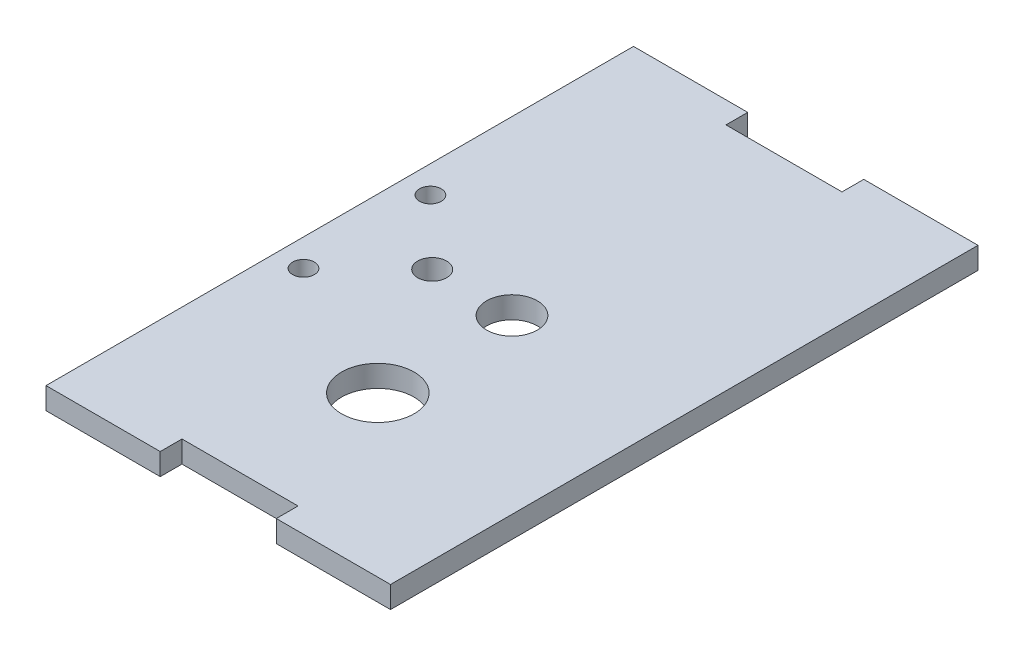
ISO-10303-21;
HEADER;
FILE_DESCRIPTION(('STEP AP214'),'2;1');
FILE_NAME('part.step','',(''),(''),'','','');
FILE_SCHEMA(('AUTOMOTIVE_DESIGN { 1 0 10303 214 1 1 1 1 }'));
ENDSEC;
DATA;
#1=APPLICATION_CONTEXT('core data for automotive mechanical design processes');
#2=APPLICATION_PROTOCOL_DEFINITION('international standard','automotive_design',2000,#1);
#3=PRODUCT_CONTEXT('',#1,'mechanical');
#4=PRODUCT('Part','Part','',(#3));
#5=PRODUCT_RELATED_PRODUCT_CATEGORY('part','',(#4));
#6=PRODUCT_DEFINITION_FORMATION('','',#4);
#7=PRODUCT_DEFINITION_CONTEXT('part definition',#1,'design');
#8=PRODUCT_DEFINITION('design','',#6,#7);
#9=PRODUCT_DEFINITION_SHAPE('','',#8);
#10=(LENGTH_UNIT() NAMED_UNIT(*) SI_UNIT(.MILLI.,.METRE.));
#11=(NAMED_UNIT(*) PLANE_ANGLE_UNIT() SI_UNIT($,.RADIAN.));
#12=(NAMED_UNIT(*) SI_UNIT($,.STERADIAN.) SOLID_ANGLE_UNIT());
#13=UNCERTAINTY_MEASURE_WITH_UNIT(LENGTH_MEASURE(1.E-05),#10,'distance_accuracy_value','');
#14=(GEOMETRIC_REPRESENTATION_CONTEXT(3) GLOBAL_UNCERTAINTY_ASSIGNED_CONTEXT((#13)) GLOBAL_UNIT_ASSIGNED_CONTEXT((#10,
#11,#12)) REPRESENTATION_CONTEXT('',''));
#15=CARTESIAN_POINT('',(0.,0.,0.));
#16=DIRECTION('',(0.,0.,1.));
#17=DIRECTION('',(1.,0.,0.));
#18=AXIS2_PLACEMENT_3D('',#15,#16,#17);
#19=CARTESIAN_POINT('',(0.,3.,0.));
#20=DIRECTION('',(0.,1.,0.));
#21=DIRECTION('',(0.,0.,1.));
#22=AXIS2_PLACEMENT_3D('',#19,#20,#21);
#23=PLANE('',#22);
#24=CARTESIAN_POINT('',(23.75,3.,-22.));
#25=DIRECTION('',(0.,1.,0.));
#26=DIRECTION('',(0.,0.,1.));
#27=AXIS2_PLACEMENT_3D('',#24,#25,#26);
#28=CIRCLE('',#27,5.);
#29=CARTESIAN_POINT('',(23.75,3.,-17.));
#30=VERTEX_POINT('',#29);
#31=EDGE_CURVE('E296',#30,#30,#28,.T.);
#32=ORIENTED_EDGE('',*,*,#31,.F.);
#33=EDGE_LOOP('',(#32));
#34=FACE_BOUND('',#33,.T.);
#35=CARTESIAN_POINT('',(3.75000000000001,3.,-31.75));
#36=DIRECTION('',(0.,1.,0.));
#37=DIRECTION('',(0.,0.,-1.));
#38=AXIS2_PLACEMENT_3D('',#35,#36,#37);
#39=CIRCLE('',#38,1.5);
#40=CARTESIAN_POINT('',(3.75000000000001,3.,-33.25));
#41=VERTEX_POINT('',#40);
#42=EDGE_CURVE('E308',#41,#41,#39,.T.);
#43=ORIENTED_EDGE('',*,*,#42,.F.);
#44=EDGE_LOOP('',(#43));
#45=FACE_BOUND('',#44,.T.);
#46=DIRECTION('',(0.,0.,1.));
#47=VECTOR('',#46,1.);
#48=CARTESIAN_POINT('',(0.,3.,-81.));
#49=LINE('',#48,#47);
#50=CARTESIAN_POINT('',(0.,3.,-81.));
#51=VERTEX_POINT('',#50);
#52=CARTESIAN_POINT('',(0.,3.,0.));
#53=VERTEX_POINT('',#52);
#54=EDGE_CURVE('E178',#51,#53,#49,.T.);
#55=ORIENTED_EDGE('',*,*,#54,.T.);
#56=DIRECTION('',(1.,0.,0.));
#57=VECTOR('',#56,1.);
#58=CARTESIAN_POINT('',(0.,3.,0.));
#59=LINE('',#58,#57);
#60=CARTESIAN_POINT('',(15.75,3.,0.));
#61=VERTEX_POINT('',#60);
#62=EDGE_CURVE('E105',#53,#61,#59,.T.);
#63=ORIENTED_EDGE('',*,*,#62,.T.);
#64=DIRECTION('',(0.,0.,-1.));
#65=VECTOR('',#64,1.);
#66=CARTESIAN_POINT('',(15.75,3.,-3.));
#67=LINE('',#66,#65);
#68=CARTESIAN_POINT('',(15.75,3.,-3.));
#69=VERTEX_POINT('',#68);
#70=EDGE_CURVE('E205',#61,#69,#67,.T.);
#71=ORIENTED_EDGE('',*,*,#70,.T.);
#72=DIRECTION('',(1.,0.,0.));
#73=VECTOR('',#72,1.);
#74=CARTESIAN_POINT('',(23.75,3.,-3.));
#75=LINE('',#74,#73);
#76=CARTESIAN_POINT('',(31.75,3.,-3.));
#77=VERTEX_POINT('',#76);
#78=EDGE_CURVE('E223',#69,#77,#75,.T.);
#79=ORIENTED_EDGE('',*,*,#78,.T.);
#80=DIRECTION('',(0.,0.,1.));
#81=VECTOR('',#80,1.);
#82=CARTESIAN_POINT('',(31.75,3.,-3.));
#83=LINE('',#82,#81);
#84=CARTESIAN_POINT('',(31.75,3.,0.));
#85=VERTEX_POINT('',#84);
#86=EDGE_CURVE('E220',#77,#85,#83,.T.);
#87=ORIENTED_EDGE('',*,*,#86,.T.);
#88=DIRECTION('',(1.,0.,0.));
#89=VECTOR('',#88,1.);
#90=CARTESIAN_POINT('',(31.75,3.,0.));
#91=LINE('',#90,#89);
#92=CARTESIAN_POINT('',(47.5,3.,0.));
#93=VERTEX_POINT('',#92);
#94=EDGE_CURVE('E222',#85,#93,#91,.T.);
#95=ORIENTED_EDGE('',*,*,#94,.T.);
#96=DIRECTION('',(0.,0.,-1.));
#97=VECTOR('',#96,1.);
#98=CARTESIAN_POINT('',(47.5,3.,0.));
#99=LINE('',#98,#97);
#100=CARTESIAN_POINT('',(47.5,3.,-81.));
#101=VERTEX_POINT('',#100);
#102=EDGE_CURVE('E225',#93,#101,#99,.T.);
#103=ORIENTED_EDGE('',*,*,#102,.T.);
#104=DIRECTION('',(-1.,0.,0.));
#105=VECTOR('',#104,1.);
#106=CARTESIAN_POINT('',(47.5,3.,-81.));
#107=LINE('',#106,#105);
#108=CARTESIAN_POINT('',(31.75,3.,-81.));
#109=VERTEX_POINT('',#108);
#110=EDGE_CURVE('E231',#101,#109,#107,.T.);
#111=ORIENTED_EDGE('',*,*,#110,.T.);
#112=DIRECTION('',(0.,0.,1.));
#113=VECTOR('',#112,1.);
#114=CARTESIAN_POINT('',(31.75,3.,-78.));
#115=LINE('',#114,#113);
#116=CARTESIAN_POINT('',(31.75,3.,-78.));
#117=VERTEX_POINT('',#116);
#118=EDGE_CURVE('E136',#109,#117,#115,.T.);
#119=ORIENTED_EDGE('',*,*,#118,.T.);
#120=DIRECTION('',(-1.,0.,0.));
#121=VECTOR('',#120,1.);
#122=CARTESIAN_POINT('',(23.75,3.,-78.));
#123=LINE('',#122,#121);
#124=CARTESIAN_POINT('',(15.75,3.,-78.));
#125=VERTEX_POINT('',#124);
#126=EDGE_CURVE('E130',#117,#125,#123,.T.);
#127=ORIENTED_EDGE('',*,*,#126,.T.);
#128=DIRECTION('',(0.,0.,-1.));
#129=VECTOR('',#128,1.);
#130=CARTESIAN_POINT('',(15.75,3.,-78.));
#131=LINE('',#130,#129);
#132=CARTESIAN_POINT('',(15.75,3.,-81.));
#133=VERTEX_POINT('',#132);
#134=EDGE_CURVE('E134',#125,#133,#131,.T.);
#135=ORIENTED_EDGE('',*,*,#134,.T.);
#136=DIRECTION('',(-1.,0.,0.));
#137=VECTOR('',#136,1.);
#138=CARTESIAN_POINT('',(15.75,3.,-81.));
#139=LINE('',#138,#137);
#140=EDGE_CURVE('E50',#133,#51,#139,.T.);
#141=ORIENTED_EDGE('',*,*,#140,.T.);
#142=EDGE_LOOP('',(#55,#63,#71,#79,#87,#95,#103,#111,#119,#127,#135,#141));
#143=FACE_BOUND('',#142,.T.);
#144=CARTESIAN_POINT('',(3.74999999999999,3.,-49.25));
#145=DIRECTION('',(0.,1.,0.));
#146=DIRECTION('',(0.,0.,1.));
#147=AXIS2_PLACEMENT_3D('',#144,#145,#146);
#148=CIRCLE('',#147,1.5);
#149=CARTESIAN_POINT('',(3.74999999999999,3.,-47.75));
#150=VERTEX_POINT('',#149);
#151=EDGE_CURVE('E157',#150,#150,#148,.T.);
#152=ORIENTED_EDGE('',*,*,#151,.F.);
#153=EDGE_LOOP('',(#152));
#154=FACE_BOUND('',#153,.T.);
#155=CARTESIAN_POINT('',(12.75,3.,-40.5));
#156=DIRECTION('',(0.,1.,0.));
#157=DIRECTION('',(0.,0.,1.));
#158=AXIS2_PLACEMENT_3D('',#155,#156,#157);
#159=CIRCLE('',#158,2.);
#160=CARTESIAN_POINT('',(12.75,3.,-38.5));
#161=VERTEX_POINT('',#160);
#162=EDGE_CURVE('E302',#161,#161,#159,.T.);
#163=ORIENTED_EDGE('',*,*,#162,.F.);
#164=EDGE_LOOP('',(#163));
#165=FACE_BOUND('',#164,.T.);
#166=CARTESIAN_POINT('',(23.75,3.,-40.5));
#167=DIRECTION('',(0.,1.,0.));
#168=DIRECTION('',(0.,0.,1.));
#169=AXIS2_PLACEMENT_3D('',#166,#167,#168);
#170=CIRCLE('',#169,3.5);
#171=CARTESIAN_POINT('',(23.75,3.,-37.));
#172=VERTEX_POINT('',#171);
#173=EDGE_CURVE('E287',#172,#172,#170,.T.);
#174=ORIENTED_EDGE('',*,*,#173,.F.);
#175=EDGE_LOOP('',(#174));
#176=FACE_BOUND('',#175,.T.);
#177=ADVANCED_FACE('F33',(#34,#45,#143,#154,#165,#176),#23,.T.);
#178=CARTESIAN_POINT('',(0.,0.,0.));
#179=DIRECTION('',(0.,1.,0.));
#180=DIRECTION('',(0.,0.,1.));
#181=AXIS2_PLACEMENT_3D('',#178,#179,#180);
#182=PLANE('',#181);
#183=DIRECTION('',(0.,0.,1.));
#184=VECTOR('',#183,1.);
#185=CARTESIAN_POINT('',(0.,0.,-81.));
#186=LINE('',#185,#184);
#187=CARTESIAN_POINT('',(0.,0.,-81.));
#188=VERTEX_POINT('',#187);
#189=CARTESIAN_POINT('',(0.,0.,0.));
#190=VERTEX_POINT('',#189);
#191=EDGE_CURVE('E153',#188,#190,#186,.T.);
#192=ORIENTED_EDGE('',*,*,#191,.F.);
#193=DIRECTION('',(-1.,0.,0.));
#194=VECTOR('',#193,1.);
#195=CARTESIAN_POINT('',(15.75,0.,-81.));
#196=LINE('',#195,#194);
#197=CARTESIAN_POINT('',(15.75,0.,-81.));
#198=VERTEX_POINT('',#197);
#199=EDGE_CURVE('E97',#198,#188,#196,.T.);
#200=ORIENTED_EDGE('',*,*,#199,.F.);
#201=DIRECTION('',(0.,0.,-1.));
#202=VECTOR('',#201,1.);
#203=CARTESIAN_POINT('',(15.75,0.,-78.));
#204=LINE('',#203,#202);
#205=CARTESIAN_POINT('',(15.75,0.,-78.));
#206=VERTEX_POINT('',#205);
#207=EDGE_CURVE('E91',#206,#198,#204,.T.);
#208=ORIENTED_EDGE('',*,*,#207,.F.);
#209=DIRECTION('',(-1.,0.,0.));
#210=VECTOR('',#209,1.);
#211=CARTESIAN_POINT('',(23.75,0.,-78.));
#212=LINE('',#211,#210);
#213=CARTESIAN_POINT('',(31.75,0.,-78.));
#214=VERTEX_POINT('',#213);
#215=EDGE_CURVE('E143',#214,#206,#212,.T.);
#216=ORIENTED_EDGE('',*,*,#215,.F.);
#217=DIRECTION('',(0.,0.,1.));
#218=VECTOR('',#217,1.);
#219=CARTESIAN_POINT('',(31.75,0.,-78.));
#220=LINE('',#219,#218);
#221=CARTESIAN_POINT('',(31.75,0.,-81.));
#222=VERTEX_POINT('',#221);
#223=EDGE_CURVE('E172',#222,#214,#220,.T.);
#224=ORIENTED_EDGE('',*,*,#223,.F.);
#225=DIRECTION('',(-1.,0.,0.));
#226=VECTOR('',#225,1.);
#227=CARTESIAN_POINT('',(47.5,0.,-81.));
#228=LINE('',#227,#226);
#229=CARTESIAN_POINT('',(47.5,0.,-81.));
#230=VERTEX_POINT('',#229);
#231=EDGE_CURVE('E170',#230,#222,#228,.T.);
#232=ORIENTED_EDGE('',*,*,#231,.F.);
#233=DIRECTION('',(0.,0.,-1.));
#234=VECTOR('',#233,1.);
#235=CARTESIAN_POINT('',(47.5,0.,0.));
#236=LINE('',#235,#234);
#237=CARTESIAN_POINT('',(47.5,0.,0.));
#238=VERTEX_POINT('',#237);
#239=EDGE_CURVE('E168',#238,#230,#236,.T.);
#240=ORIENTED_EDGE('',*,*,#239,.F.);
#241=DIRECTION('',(1.,0.,0.));
#242=VECTOR('',#241,1.);
#243=CARTESIAN_POINT('',(31.75,0.,0.));
#244=LINE('',#243,#242);
#245=CARTESIAN_POINT('',(31.75,0.,0.));
#246=VERTEX_POINT('',#245);
#247=EDGE_CURVE('E166',#246,#238,#244,.T.);
#248=ORIENTED_EDGE('',*,*,#247,.F.);
#249=DIRECTION('',(0.,0.,1.));
#250=VECTOR('',#249,1.);
#251=CARTESIAN_POINT('',(31.75,0.,-3.));
#252=LINE('',#251,#250);
#253=CARTESIAN_POINT('',(31.75,0.,-3.));
#254=VERTEX_POINT('',#253);
#255=EDGE_CURVE('E164',#254,#246,#252,.T.);
#256=ORIENTED_EDGE('',*,*,#255,.F.);
#257=DIRECTION('',(1.,0.,0.));
#258=VECTOR('',#257,1.);
#259=CARTESIAN_POINT('',(23.75,0.,-3.));
#260=LINE('',#259,#258);
#261=CARTESIAN_POINT('',(15.75,0.,-3.));
#262=VERTEX_POINT('',#261);
#263=EDGE_CURVE('E162',#262,#254,#260,.T.);
#264=ORIENTED_EDGE('',*,*,#263,.F.);
#265=DIRECTION('',(0.,0.,-1.));
#266=VECTOR('',#265,1.);
#267=CARTESIAN_POINT('',(15.75,0.,-3.));
#268=LINE('',#267,#266);
#269=CARTESIAN_POINT('',(15.75,0.,0.));
#270=VERTEX_POINT('',#269);
#271=EDGE_CURVE('E159',#270,#262,#268,.T.);
#272=ORIENTED_EDGE('',*,*,#271,.F.);
#273=DIRECTION('',(1.,0.,0.));
#274=VECTOR('',#273,1.);
#275=CARTESIAN_POINT('',(0.,0.,0.));
#276=LINE('',#275,#274);
#277=EDGE_CURVE('E156',#190,#270,#276,.T.);
#278=ORIENTED_EDGE('',*,*,#277,.F.);
#279=EDGE_LOOP('',(#192,#200,#208,#216,#224,#232,#240,#248,#256,#264,#272,#278));
#280=FACE_BOUND('',#279,.T.);
#281=CARTESIAN_POINT('',(3.74999999999999,0.,-49.25));
#282=DIRECTION('',(0.,1.,0.));
#283=DIRECTION('',(0.,0.,1.));
#284=AXIS2_PLACEMENT_3D('',#281,#282,#283);
#285=CIRCLE('',#284,1.5);
#286=CARTESIAN_POINT('',(3.74999999999999,0.,-47.75));
#287=VERTEX_POINT('',#286);
#288=EDGE_CURVE('E311',#287,#287,#285,.T.);
#289=ORIENTED_EDGE('',*,*,#288,.T.);
#290=EDGE_LOOP('',(#289));
#291=FACE_BOUND('',#290,.T.);
#292=CARTESIAN_POINT('',(3.75000000000001,0.,-31.75));
#293=DIRECTION('',(0.,1.,0.));
#294=DIRECTION('',(0.,0.,-1.));
#295=AXIS2_PLACEMENT_3D('',#292,#293,#294);
#296=CIRCLE('',#295,1.5);
#297=CARTESIAN_POINT('',(3.75000000000001,0.,-33.25));
#298=VERTEX_POINT('',#297);
#299=EDGE_CURVE('E305',#298,#298,#296,.T.);
#300=ORIENTED_EDGE('',*,*,#299,.T.);
#301=EDGE_LOOP('',(#300));
#302=FACE_BOUND('',#301,.T.);
#303=CARTESIAN_POINT('',(12.75,0.,-40.5));
#304=DIRECTION('',(0.,1.,0.));
#305=DIRECTION('',(0.,0.,1.));
#306=AXIS2_PLACEMENT_3D('',#303,#304,#305);
#307=CIRCLE('',#306,2.);
#308=CARTESIAN_POINT('',(12.75,0.,-38.5));
#309=VERTEX_POINT('',#308);
#310=EDGE_CURVE('E299',#309,#309,#307,.T.);
#311=ORIENTED_EDGE('',*,*,#310,.T.);
#312=EDGE_LOOP('',(#311));
#313=FACE_BOUND('',#312,.T.);
#314=CARTESIAN_POINT('',(23.75,0.,-22.));
#315=DIRECTION('',(0.,1.,0.));
#316=DIRECTION('',(0.,0.,1.));
#317=AXIS2_PLACEMENT_3D('',#314,#315,#316);
#318=CIRCLE('',#317,5.);
#319=CARTESIAN_POINT('',(23.75,0.,-17.));
#320=VERTEX_POINT('',#319);
#321=EDGE_CURVE('E293',#320,#320,#318,.T.);
#322=ORIENTED_EDGE('',*,*,#321,.T.);
#323=EDGE_LOOP('',(#322));
#324=FACE_BOUND('',#323,.T.);
#325=CARTESIAN_POINT('',(23.75,0.,-40.5));
#326=DIRECTION('',(0.,1.,0.));
#327=DIRECTION('',(0.,0.,1.));
#328=AXIS2_PLACEMENT_3D('',#325,#326,#327);
#329=CIRCLE('',#328,3.5);
#330=CARTESIAN_POINT('',(23.75,0.,-37.));
#331=VERTEX_POINT('',#330);
#332=EDGE_CURVE('E290',#331,#331,#329,.T.);
#333=ORIENTED_EDGE('',*,*,#332,.T.);
#334=EDGE_LOOP('',(#333));
#335=FACE_BOUND('',#334,.T.);
#336=ADVANCED_FACE('F208',(#280,#291,#302,#313,#324,#335),#182,.F.);
#337=CARTESIAN_POINT('',(0.,3.,-81.));
#338=DIRECTION('',(1.,0.,0.));
#339=DIRECTION('',(0.,0.,-1.));
#340=AXIS2_PLACEMENT_3D('',#337,#338,#339);
#341=PLANE('',#340);
#342=ORIENTED_EDGE('',*,*,#191,.T.);
#343=DIRECTION('',(0.,-1.,0.));
#344=VECTOR('',#343,1.);
#345=CARTESIAN_POINT('',(0.,3.,0.));
#346=LINE('',#345,#344);
#347=EDGE_CURVE('E11',#53,#190,#346,.T.);
#348=ORIENTED_EDGE('',*,*,#347,.F.);
#349=ORIENTED_EDGE('',*,*,#54,.F.);
#350=DIRECTION('',(0.,-1.,0.));
#351=VECTOR('',#350,1.);
#352=CARTESIAN_POINT('',(0.,3.,-81.));
#353=LINE('',#352,#351);
#354=EDGE_CURVE('E149',#51,#188,#353,.T.);
#355=ORIENTED_EDGE('',*,*,#354,.T.);
#356=EDGE_LOOP('',(#342,#348,#349,#355));
#357=FACE_BOUND('',#356,.T.);
#358=ADVANCED_FACE('F35',(#357),#341,.F.);
#359=CARTESIAN_POINT('',(0.,3.,0.));
#360=DIRECTION('',(0.,0.,-1.));
#361=DIRECTION('',(-1.,0.,0.));
#362=AXIS2_PLACEMENT_3D('',#359,#360,#361);
#363=PLANE('',#362);
#364=ORIENTED_EDGE('',*,*,#277,.T.);
#365=DIRECTION('',(0.,-1.,0.));
#366=VECTOR('',#365,1.);
#367=CARTESIAN_POINT('',(15.75,3.,0.));
#368=LINE('',#367,#366);
#369=EDGE_CURVE('E42',#61,#270,#368,.T.);
#370=ORIENTED_EDGE('',*,*,#369,.F.);
#371=ORIENTED_EDGE('',*,*,#62,.F.);
#372=ORIENTED_EDGE('',*,*,#347,.T.);
#373=EDGE_LOOP('',(#364,#370,#371,#372));
#374=FACE_BOUND('',#373,.T.);
#375=ADVANCED_FACE('F432',(#374),#363,.F.);
#376=CARTESIAN_POINT('',(15.75,3.,-3.));
#377=DIRECTION('',(-1.,0.,0.));
#378=DIRECTION('',(0.,0.,1.));
#379=AXIS2_PLACEMENT_3D('',#376,#377,#378);
#380=PLANE('',#379);
#381=ORIENTED_EDGE('',*,*,#271,.T.);
#382=DIRECTION('',(0.,-1.,0.));
#383=VECTOR('',#382,1.);
#384=CARTESIAN_POINT('',(15.75,3.,-3.));
#385=LINE('',#384,#383);
#386=EDGE_CURVE('E197',#69,#262,#385,.T.);
#387=ORIENTED_EDGE('',*,*,#386,.F.);
#388=ORIENTED_EDGE('',*,*,#70,.F.);
#389=ORIENTED_EDGE('',*,*,#369,.T.);
#390=EDGE_LOOP('',(#381,#387,#388,#389));
#391=FACE_BOUND('',#390,.T.);
#392=ADVANCED_FACE('F203',(#391),#380,.F.);
#393=CARTESIAN_POINT('',(23.75,3.,-3.));
#394=DIRECTION('',(0.,0.,-1.));
#395=DIRECTION('',(-1.,0.,0.));
#396=AXIS2_PLACEMENT_3D('',#393,#394,#395);
#397=PLANE('',#396);
#398=ORIENTED_EDGE('',*,*,#263,.T.);
#399=DIRECTION('',(0.,-1.,0.));
#400=VECTOR('',#399,1.);
#401=CARTESIAN_POINT('',(31.75,3.,-3.));
#402=LINE('',#401,#400);
#403=EDGE_CURVE('E194',#77,#254,#402,.T.);
#404=ORIENTED_EDGE('',*,*,#403,.F.);
#405=ORIENTED_EDGE('',*,*,#78,.F.);
#406=ORIENTED_EDGE('',*,*,#386,.T.);
#407=EDGE_LOOP('',(#398,#404,#405,#406));
#408=FACE_BOUND('',#407,.T.);
#409=ADVANCED_FACE('F214',(#408),#397,.F.);
#410=CARTESIAN_POINT('',(31.75,3.,-3.));
#411=DIRECTION('',(1.,0.,0.));
#412=DIRECTION('',(0.,0.,-1.));
#413=AXIS2_PLACEMENT_3D('',#410,#411,#412);
#414=PLANE('',#413);
#415=ORIENTED_EDGE('',*,*,#255,.T.);
#416=DIRECTION('',(0.,-1.,0.));
#417=VECTOR('',#416,1.);
#418=CARTESIAN_POINT('',(31.75,3.,0.));
#419=LINE('',#418,#417);
#420=EDGE_CURVE('E191',#85,#246,#419,.T.);
#421=ORIENTED_EDGE('',*,*,#420,.F.);
#422=ORIENTED_EDGE('',*,*,#86,.F.);
#423=ORIENTED_EDGE('',*,*,#403,.T.);
#424=EDGE_LOOP('',(#415,#421,#422,#423));
#425=FACE_BOUND('',#424,.T.);
#426=ADVANCED_FACE('F218',(#425),#414,.F.);
#427=CARTESIAN_POINT('',(31.75,3.,0.));
#428=DIRECTION('',(0.,0.,-1.));
#429=DIRECTION('',(-1.,0.,0.));
#430=AXIS2_PLACEMENT_3D('',#427,#428,#429);
#431=PLANE('',#430);
#432=ORIENTED_EDGE('',*,*,#247,.T.);
#433=DIRECTION('',(0.,-1.,0.));
#434=VECTOR('',#433,1.);
#435=CARTESIAN_POINT('',(47.5,3.,0.));
#436=LINE('',#435,#434);
#437=EDGE_CURVE('E188',#93,#238,#436,.T.);
#438=ORIENTED_EDGE('',*,*,#437,.F.);
#439=ORIENTED_EDGE('',*,*,#94,.F.);
#440=ORIENTED_EDGE('',*,*,#420,.T.);
#441=EDGE_LOOP('',(#432,#438,#439,#440));
#442=FACE_BOUND('',#441,.T.);
#443=ADVANCED_FACE('F396',(#442),#431,.F.);
#444=CARTESIAN_POINT('',(47.5,3.,0.));
#445=DIRECTION('',(-1.,0.,0.));
#446=DIRECTION('',(0.,0.,1.));
#447=AXIS2_PLACEMENT_3D('',#444,#445,#446);
#448=PLANE('',#447);
#449=ORIENTED_EDGE('',*,*,#239,.T.);
#450=DIRECTION('',(0.,-1.,0.));
#451=VECTOR('',#450,1.);
#452=CARTESIAN_POINT('',(47.5,3.,-81.));
#453=LINE('',#452,#451);
#454=EDGE_CURVE('E185',#101,#230,#453,.T.);
#455=ORIENTED_EDGE('',*,*,#454,.F.);
#456=ORIENTED_EDGE('',*,*,#102,.F.);
#457=ORIENTED_EDGE('',*,*,#437,.T.);
#458=EDGE_LOOP('',(#449,#455,#456,#457));
#459=FACE_BOUND('',#458,.T.);
#460=ADVANCED_FACE('F387',(#459),#448,.F.);
#461=CARTESIAN_POINT('',(47.5,3.,-81.));
#462=DIRECTION('',(0.,0.,1.));
#463=DIRECTION('',(1.,0.,0.));
#464=AXIS2_PLACEMENT_3D('',#461,#462,#463);
#465=PLANE('',#464);
#466=ORIENTED_EDGE('',*,*,#231,.T.);
#467=DIRECTION('',(0.,-1.,0.));
#468=VECTOR('',#467,1.);
#469=CARTESIAN_POINT('',(31.75,3.,-81.));
#470=LINE('',#469,#468);
#471=EDGE_CURVE('E182',#109,#222,#470,.T.);
#472=ORIENTED_EDGE('',*,*,#471,.F.);
#473=ORIENTED_EDGE('',*,*,#110,.F.);
#474=ORIENTED_EDGE('',*,*,#454,.T.);
#475=EDGE_LOOP('',(#466,#472,#473,#474));
#476=FACE_BOUND('',#475,.T.);
#477=ADVANCED_FACE('F237',(#476),#465,.F.);
#478=CARTESIAN_POINT('',(31.75,3.,-78.));
#479=DIRECTION('',(1.,0.,0.));
#480=DIRECTION('',(0.,0.,-1.));
#481=AXIS2_PLACEMENT_3D('',#478,#479,#480);
#482=PLANE('',#481);
#483=ORIENTED_EDGE('',*,*,#223,.T.);
#484=DIRECTION('',(0.,-1.,0.));
#485=VECTOR('',#484,1.);
#486=CARTESIAN_POINT('',(31.75,3.,-78.));
#487=LINE('',#486,#485);
#488=EDGE_CURVE('E144',#117,#214,#487,.T.);
#489=ORIENTED_EDGE('',*,*,#488,.F.);
#490=ORIENTED_EDGE('',*,*,#118,.F.);
#491=ORIENTED_EDGE('',*,*,#471,.T.);
#492=EDGE_LOOP('',(#483,#489,#490,#491));
#493=FACE_BOUND('',#492,.T.);
#494=ADVANCED_FACE('F241',(#493),#482,.F.);
#495=CARTESIAN_POINT('',(23.75,3.,-78.));
#496=DIRECTION('',(0.,0.,1.));
#497=DIRECTION('',(1.,0.,0.));
#498=AXIS2_PLACEMENT_3D('',#495,#496,#497);
#499=PLANE('',#498);
#500=ORIENTED_EDGE('',*,*,#215,.T.);
#501=DIRECTION('',(0.,-1.,0.));
#502=VECTOR('',#501,1.);
#503=CARTESIAN_POINT('',(15.75,3.,-78.));
#504=LINE('',#503,#502);
#505=EDGE_CURVE('E141',#125,#206,#504,.T.);
#506=ORIENTED_EDGE('',*,*,#505,.F.);
#507=ORIENTED_EDGE('',*,*,#126,.F.);
#508=ORIENTED_EDGE('',*,*,#488,.T.);
#509=EDGE_LOOP('',(#500,#506,#507,#508));
#510=FACE_BOUND('',#509,.T.);
#511=ADVANCED_FACE('F142',(#510),#499,.F.);
#512=CARTESIAN_POINT('',(15.75,3.,-78.));
#513=DIRECTION('',(-1.,0.,0.));
#514=DIRECTION('',(0.,0.,1.));
#515=AXIS2_PLACEMENT_3D('',#512,#513,#514);
#516=PLANE('',#515);
#517=ORIENTED_EDGE('',*,*,#207,.T.);
#518=DIRECTION('',(0.,-1.,0.));
#519=VECTOR('',#518,1.);
#520=CARTESIAN_POINT('',(15.75,3.,-81.));
#521=LINE('',#520,#519);
#522=EDGE_CURVE('E145',#133,#198,#521,.T.);
#523=ORIENTED_EDGE('',*,*,#522,.F.);
#524=ORIENTED_EDGE('',*,*,#134,.F.);
#525=ORIENTED_EDGE('',*,*,#505,.T.);
#526=EDGE_LOOP('',(#517,#523,#524,#525));
#527=FACE_BOUND('',#526,.T.);
#528=ADVANCED_FACE('F147',(#527),#516,.F.);
#529=CARTESIAN_POINT('',(15.75,3.,-81.));
#530=DIRECTION('',(0.,0.,1.));
#531=DIRECTION('',(1.,0.,0.));
#532=AXIS2_PLACEMENT_3D('',#529,#530,#531);
#533=PLANE('',#532);
#534=ORIENTED_EDGE('',*,*,#199,.T.);
#535=ORIENTED_EDGE('',*,*,#354,.F.);
#536=ORIENTED_EDGE('',*,*,#140,.F.);
#537=ORIENTED_EDGE('',*,*,#522,.T.);
#538=EDGE_LOOP('',(#534,#535,#536,#537));
#539=FACE_BOUND('',#538,.T.);
#540=ADVANCED_FACE('F246',(#539),#533,.F.);
#541=CARTESIAN_POINT('',(3.74999999999999,3.,-49.25));
#542=DIRECTION('',(0.,-1.,0.));
#543=DIRECTION('',(0.,0.,-1.));
#544=AXIS2_PLACEMENT_3D('',#541,#542,#543);
#545=CYLINDRICAL_SURFACE('',#544,1.5);
#546=ORIENTED_EDGE('',*,*,#151,.T.);
#547=EDGE_LOOP('',(#546));
#548=FACE_BOUND('',#547,.T.);
#549=ORIENTED_EDGE('',*,*,#288,.F.);
#550=EDGE_LOOP('',(#549));
#551=FACE_BOUND('',#550,.T.);
#552=ADVANCED_FACE('F248',(#548,#551),#545,.F.);
#553=CARTESIAN_POINT('',(3.75000000000001,3.,-31.75));
#554=DIRECTION('',(0.,-1.,0.));
#555=DIRECTION('',(0.,0.,-1.));
#556=AXIS2_PLACEMENT_3D('',#553,#554,#555);
#557=CYLINDRICAL_SURFACE('',#556,1.5);
#558=ORIENTED_EDGE('',*,*,#42,.T.);
#559=EDGE_LOOP('',(#558));
#560=FACE_BOUND('',#559,.T.);
#561=ORIENTED_EDGE('',*,*,#299,.F.);
#562=EDGE_LOOP('',(#561));
#563=FACE_BOUND('',#562,.T.);
#564=ADVANCED_FACE('F254',(#560,#563),#557,.F.);
#565=CARTESIAN_POINT('',(12.75,3.,-40.5));
#566=DIRECTION('',(0.,-1.,0.));
#567=DIRECTION('',(0.,0.,-1.));
#568=AXIS2_PLACEMENT_3D('',#565,#566,#567);
#569=CYLINDRICAL_SURFACE('',#568,2.);
#570=ORIENTED_EDGE('',*,*,#162,.T.);
#571=EDGE_LOOP('',(#570));
#572=FACE_BOUND('',#571,.T.);
#573=ORIENTED_EDGE('',*,*,#310,.F.);
#574=EDGE_LOOP('',(#573));
#575=FACE_BOUND('',#574,.T.);
#576=ADVANCED_FACE('F270',(#572,#575),#569,.F.);
#577=CARTESIAN_POINT('',(23.75,3.,-22.));
#578=DIRECTION('',(0.,-1.,0.));
#579=DIRECTION('',(0.,0.,-1.));
#580=AXIS2_PLACEMENT_3D('',#577,#578,#579);
#581=CYLINDRICAL_SURFACE('',#580,5.);
#582=ORIENTED_EDGE('',*,*,#31,.T.);
#583=EDGE_LOOP('',(#582));
#584=FACE_BOUND('',#583,.T.);
#585=ORIENTED_EDGE('',*,*,#321,.F.);
#586=EDGE_LOOP('',(#585));
#587=FACE_BOUND('',#586,.T.);
#588=ADVANCED_FACE('F274',(#584,#587),#581,.F.);
#589=CARTESIAN_POINT('',(23.75,3.,-40.5));
#590=DIRECTION('',(0.,-1.,0.));
#591=DIRECTION('',(0.,0.,-1.));
#592=AXIS2_PLACEMENT_3D('',#589,#590,#591);
#593=CYLINDRICAL_SURFACE('',#592,3.5);
#594=ORIENTED_EDGE('',*,*,#173,.T.);
#595=EDGE_LOOP('',(#594));
#596=FACE_BOUND('',#595,.T.);
#597=ORIENTED_EDGE('',*,*,#332,.F.);
#598=EDGE_LOOP('',(#597));
#599=FACE_BOUND('',#598,.T.);
#600=ADVANCED_FACE('F278',(#596,#599),#593,.F.);
#601=CLOSED_SHELL('',(#177,#336,#358,#375,#392,#409,#426,#443,#460,#477,#494,#511,#528,#540,
#552,#564,#576,#588,#600));
#602=MANIFOLD_SOLID_BREP('B2',#601);
#603=ADVANCED_BREP_SHAPE_REPRESENTATION('',(#18,#602),#14);
#604=SHAPE_DEFINITION_REPRESENTATION(#9,#603);
ENDSEC;
END-ISO-10303-21;
